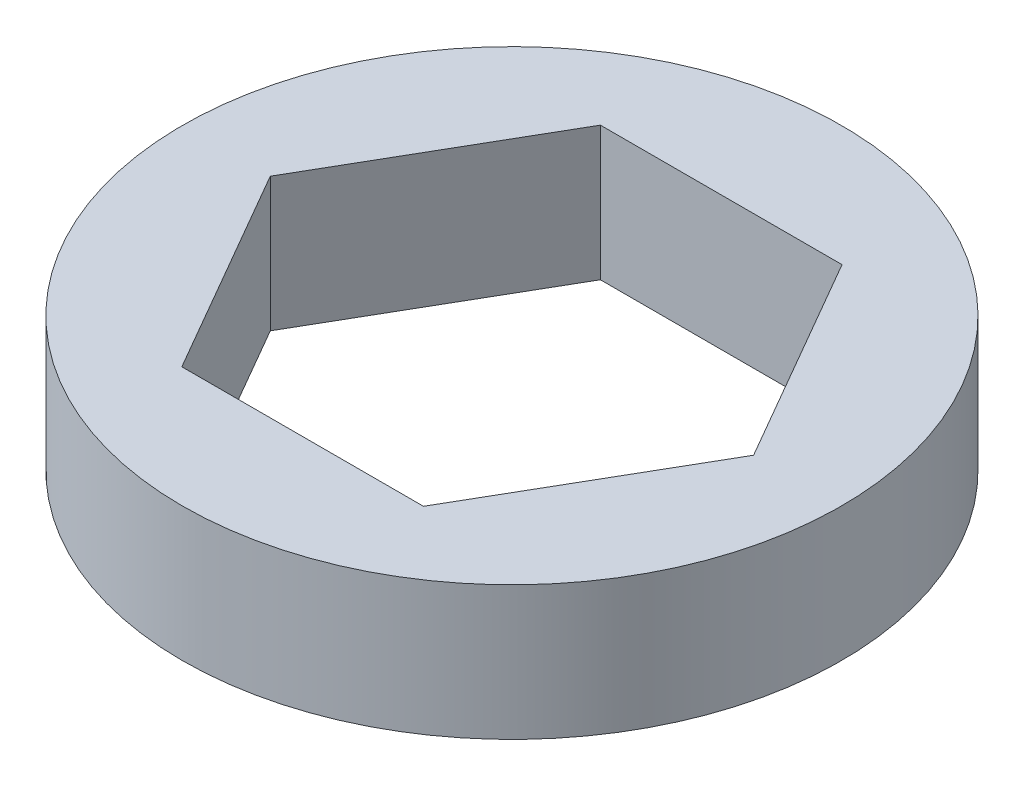
ISO-10303-21;
HEADER;
FILE_DESCRIPTION(('STEP AP214'),'2;1');
FILE_NAME('part.step','',(''),(''),'','','');
FILE_SCHEMA(('AUTOMOTIVE_DESIGN { 1 0 10303 214 1 1 1 1 }'));
ENDSEC;
DATA;
#1=APPLICATION_CONTEXT('core data for automotive mechanical design processes');
#2=APPLICATION_PROTOCOL_DEFINITION('international standard','automotive_design',2000,#1);
#3=PRODUCT_CONTEXT('',#1,'mechanical');
#4=PRODUCT('Part','Part','',(#3));
#5=PRODUCT_RELATED_PRODUCT_CATEGORY('part','',(#4));
#6=PRODUCT_DEFINITION_FORMATION('','',#4);
#7=PRODUCT_DEFINITION_CONTEXT('part definition',#1,'design');
#8=PRODUCT_DEFINITION('design','',#6,#7);
#9=PRODUCT_DEFINITION_SHAPE('','',#8);
#10=(LENGTH_UNIT() NAMED_UNIT(*) SI_UNIT(.MILLI.,.METRE.));
#11=(NAMED_UNIT(*) PLANE_ANGLE_UNIT() SI_UNIT($,.RADIAN.));
#12=(NAMED_UNIT(*) SI_UNIT($,.STERADIAN.) SOLID_ANGLE_UNIT());
#13=UNCERTAINTY_MEASURE_WITH_UNIT(LENGTH_MEASURE(1.E-05),#10,'distance_accuracy_value','');
#14=(GEOMETRIC_REPRESENTATION_CONTEXT(3) GLOBAL_UNCERTAINTY_ASSIGNED_CONTEXT((#13)) GLOBAL_UNIT_ASSIGNED_CONTEXT((#10,
#11,#12)) REPRESENTATION_CONTEXT('',''));
#15=CARTESIAN_POINT('',(0.,0.,0.));
#16=DIRECTION('',(0.,0.,1.));
#17=DIRECTION('',(1.,0.,0.));
#18=AXIS2_PLACEMENT_3D('',#15,#16,#17);
#19=CARTESIAN_POINT('',(0.,4.064,0.));
#20=DIRECTION('',(0.,1.,0.));
#21=DIRECTION('',(0.,0.,1.));
#22=AXIS2_PLACEMENT_3D('',#19,#20,#21);
#23=PLANE('',#22);
#24=CARTESIAN_POINT('',(0.,4.064,0.));
#25=DIRECTION('',(0.,1.,0.));
#26=DIRECTION('',(0.,0.,1.));
#27=AXIS2_PLACEMENT_3D('',#24,#25,#26);
#28=CIRCLE('',#27,10.);
#29=CARTESIAN_POINT('',(0.,4.064,10.));
#30=VERTEX_POINT('',#29);
#31=EDGE_CURVE('E11',#30,#30,#28,.T.);
#32=ORIENTED_EDGE('',*,*,#31,.T.);
#33=EDGE_LOOP('',(#32));
#34=FACE_BOUND('',#33,.T.);
#35=DIRECTION('',(0.5,0.,0.866025403784439));
#36=VECTOR('',#35,1.);
#37=CARTESIAN_POINT('',(-7.33234841870825,4.064,0.));
#38=LINE('',#37,#36);
#39=CARTESIAN_POINT('',(-7.33234841870825,4.064,0.));
#40=VERTEX_POINT('',#39);
#41=CARTESIAN_POINT('',(-3.66617420935413,4.064,6.35));
#42=VERTEX_POINT('',#41);
#43=EDGE_CURVE('E93',#40,#42,#38,.T.);
#44=ORIENTED_EDGE('',*,*,#43,.F.);
#45=DIRECTION('',(-0.5,0.,0.866025403784439));
#46=VECTOR('',#45,1.);
#47=CARTESIAN_POINT('',(-3.66617420935412,4.064,-6.35));
#48=LINE('',#47,#46);
#49=CARTESIAN_POINT('',(-3.66617420935412,4.064,-6.35));
#50=VERTEX_POINT('',#49);
#51=EDGE_CURVE('E85',#50,#40,#48,.T.);
#52=ORIENTED_EDGE('',*,*,#51,.F.);
#53=DIRECTION('',(-1.,0.,0.));
#54=VECTOR('',#53,1.);
#55=CARTESIAN_POINT('',(3.66617420935412,4.064,-6.35));
#56=LINE('',#55,#54);
#57=CARTESIAN_POINT('',(3.66617420935412,4.064,-6.35));
#58=VERTEX_POINT('',#57);
#59=EDGE_CURVE('E113',#58,#50,#56,.T.);
#60=ORIENTED_EDGE('',*,*,#59,.F.);
#61=DIRECTION('',(-0.5,0.,-0.866025403784439));
#62=VECTOR('',#61,1.);
#63=CARTESIAN_POINT('',(7.33234841870825,4.064,0.));
#64=LINE('',#63,#62);
#65=CARTESIAN_POINT('',(7.33234841870825,4.064,0.));
#66=VERTEX_POINT('',#65);
#67=EDGE_CURVE('E111',#66,#58,#64,.T.);
#68=ORIENTED_EDGE('',*,*,#67,.F.);
#69=DIRECTION('',(0.5,0.,-0.866025403784439));
#70=VECTOR('',#69,1.);
#71=CARTESIAN_POINT('',(3.66617420935412,4.064,6.35));
#72=LINE('',#71,#70);
#73=CARTESIAN_POINT('',(3.66617420935412,4.064,6.35));
#74=VERTEX_POINT('',#73);
#75=EDGE_CURVE('E107',#74,#66,#72,.T.);
#76=ORIENTED_EDGE('',*,*,#75,.F.);
#77=DIRECTION('',(1.,0.,0.));
#78=VECTOR('',#77,1.);
#79=CARTESIAN_POINT('',(-3.66617420935413,4.064,6.35));
#80=LINE('',#79,#78);
#81=EDGE_CURVE('E105',#42,#74,#80,.T.);
#82=ORIENTED_EDGE('',*,*,#81,.F.);
#83=EDGE_LOOP('',(#44,#52,#60,#68,#76,#82));
#84=FACE_BOUND('',#83,.T.);
#85=ADVANCED_FACE('F32',(#34,#84),#23,.T.);
#86=CARTESIAN_POINT('',(0.,0.,0.));
#87=DIRECTION('',(0.,1.,0.));
#88=DIRECTION('',(0.,0.,1.));
#89=AXIS2_PLACEMENT_3D('',#86,#87,#88);
#90=PLANE('',#89);
#91=CARTESIAN_POINT('',(0.,0.,0.));
#92=DIRECTION('',(0.,1.,0.));
#93=DIRECTION('',(0.,0.,1.));
#94=AXIS2_PLACEMENT_3D('',#91,#92,#93);
#95=CIRCLE('',#94,10.);
#96=CARTESIAN_POINT('',(0.,0.,10.));
#97=VERTEX_POINT('',#96);
#98=EDGE_CURVE('E36',#97,#97,#95,.T.);
#99=ORIENTED_EDGE('',*,*,#98,.F.);
#100=EDGE_LOOP('',(#99));
#101=FACE_BOUND('',#100,.T.);
#102=DIRECTION('',(-0.5,0.,0.866025403784439));
#103=VECTOR('',#102,1.);
#104=CARTESIAN_POINT('',(-3.66617420935412,0.,-6.35));
#105=LINE('',#104,#103);
#106=CARTESIAN_POINT('',(-3.66617420935412,0.,-6.35));
#107=VERTEX_POINT('',#106);
#108=CARTESIAN_POINT('',(-7.33234841870825,0.,0.));
#109=VERTEX_POINT('',#108);
#110=EDGE_CURVE('E55',#107,#109,#105,.T.);
#111=ORIENTED_EDGE('',*,*,#110,.T.);
#112=DIRECTION('',(0.5,0.,0.866025403784439));
#113=VECTOR('',#112,1.);
#114=CARTESIAN_POINT('',(-7.33234841870825,0.,0.));
#115=LINE('',#114,#113);
#116=CARTESIAN_POINT('',(-3.66617420935413,0.,6.35));
#117=VERTEX_POINT('',#116);
#118=EDGE_CURVE('E100',#109,#117,#115,.T.);
#119=ORIENTED_EDGE('',*,*,#118,.T.);
#120=DIRECTION('',(1.,0.,0.));
#121=VECTOR('',#120,1.);
#122=CARTESIAN_POINT('',(-3.66617420935413,0.,6.35));
#123=LINE('',#122,#121);
#124=CARTESIAN_POINT('',(3.66617420935412,0.,6.35));
#125=VERTEX_POINT('',#124);
#126=EDGE_CURVE('E117',#117,#125,#123,.T.);
#127=ORIENTED_EDGE('',*,*,#126,.T.);
#128=DIRECTION('',(0.5,0.,-0.866025403784439));
#129=VECTOR('',#128,1.);
#130=CARTESIAN_POINT('',(3.66617420935412,0.,6.35));
#131=LINE('',#130,#129);
#132=CARTESIAN_POINT('',(7.33234841870825,0.,0.));
#133=VERTEX_POINT('',#132);
#134=EDGE_CURVE('E120',#125,#133,#131,.T.);
#135=ORIENTED_EDGE('',*,*,#134,.T.);
#136=DIRECTION('',(-0.5,0.,-0.866025403784439));
#137=VECTOR('',#136,1.);
#138=CARTESIAN_POINT('',(7.33234841870825,0.,0.));
#139=LINE('',#138,#137);
#140=CARTESIAN_POINT('',(3.66617420935412,0.,-6.35));
#141=VERTEX_POINT('',#140);
#142=EDGE_CURVE('E123',#133,#141,#139,.T.);
#143=ORIENTED_EDGE('',*,*,#142,.T.);
#144=DIRECTION('',(-1.,0.,0.));
#145=VECTOR('',#144,1.);
#146=CARTESIAN_POINT('',(3.66617420935412,0.,-6.35));
#147=LINE('',#146,#145);
#148=EDGE_CURVE('E94',#141,#107,#147,.T.);
#149=ORIENTED_EDGE('',*,*,#148,.T.);
#150=EDGE_LOOP('',(#111,#119,#127,#135,#143,#149));
#151=FACE_BOUND('',#150,.T.);
#152=ADVANCED_FACE('F140',(#101,#151),#90,.F.);
#153=CARTESIAN_POINT('',(0.,4.064,0.));
#154=DIRECTION('',(0.,-1.,0.));
#155=DIRECTION('',(0.,0.,-1.));
#156=AXIS2_PLACEMENT_3D('',#153,#154,#155);
#157=CYLINDRICAL_SURFACE('',#156,10.);
#158=ORIENTED_EDGE('',*,*,#31,.F.);
#159=EDGE_LOOP('',(#158));
#160=FACE_BOUND('',#159,.T.);
#161=ORIENTED_EDGE('',*,*,#98,.T.);
#162=EDGE_LOOP('',(#161));
#163=FACE_BOUND('',#162,.T.);
#164=ADVANCED_FACE('F34',(#160,#163),#157,.T.);
#165=CARTESIAN_POINT('',(-3.66617420935412,4.064,-6.35));
#166=DIRECTION('',(0.866025403784439,0.,0.5));
#167=DIRECTION('',(0.5,0.,-0.866025403784439));
#168=AXIS2_PLACEMENT_3D('',#165,#166,#167);
#169=PLANE('',#168);
#170=ORIENTED_EDGE('',*,*,#110,.F.);
#171=DIRECTION('',(0.,-1.,0.));
#172=VECTOR('',#171,1.);
#173=CARTESIAN_POINT('',(-3.66617420935412,4.064,-6.35));
#174=LINE('',#173,#172);
#175=EDGE_CURVE('E89',#50,#107,#174,.T.);
#176=ORIENTED_EDGE('',*,*,#175,.F.);
#177=ORIENTED_EDGE('',*,*,#51,.T.);
#178=DIRECTION('',(0.,-1.,0.));
#179=VECTOR('',#178,1.);
#180=CARTESIAN_POINT('',(-7.33234841870825,4.064,0.));
#181=LINE('',#180,#179);
#182=EDGE_CURVE('E88',#40,#109,#181,.T.);
#183=ORIENTED_EDGE('',*,*,#182,.T.);
#184=EDGE_LOOP('',(#170,#176,#177,#183));
#185=FACE_BOUND('',#184,.T.);
#186=ADVANCED_FACE('F87',(#185),#169,.T.);
#187=CARTESIAN_POINT('',(-7.33234841870825,4.064,0.));
#188=DIRECTION('',(0.866025403784439,0.,-0.5));
#189=DIRECTION('',(-0.5,0.,-0.866025403784439));
#190=AXIS2_PLACEMENT_3D('',#187,#188,#189);
#191=PLANE('',#190);
#192=ORIENTED_EDGE('',*,*,#118,.F.);
#193=ORIENTED_EDGE('',*,*,#182,.F.);
#194=ORIENTED_EDGE('',*,*,#43,.T.);
#195=DIRECTION('',(0.,-1.,0.));
#196=VECTOR('',#195,1.);
#197=CARTESIAN_POINT('',(-3.66617420935413,4.064,6.35));
#198=LINE('',#197,#196);
#199=EDGE_CURVE('E101',#42,#117,#198,.T.);
#200=ORIENTED_EDGE('',*,*,#199,.T.);
#201=EDGE_LOOP('',(#192,#193,#194,#200));
#202=FACE_BOUND('',#201,.T.);
#203=ADVANCED_FACE('F97',(#202),#191,.T.);
#204=CARTESIAN_POINT('',(-3.66617420935413,4.064,6.35));
#205=DIRECTION('',(0.,0.,-1.));
#206=DIRECTION('',(-1.,0.,0.));
#207=AXIS2_PLACEMENT_3D('',#204,#205,#206);
#208=PLANE('',#207);
#209=ORIENTED_EDGE('',*,*,#126,.F.);
#210=ORIENTED_EDGE('',*,*,#199,.F.);
#211=ORIENTED_EDGE('',*,*,#81,.T.);
#212=DIRECTION('',(0.,-1.,0.));
#213=VECTOR('',#212,1.);
#214=CARTESIAN_POINT('',(3.66617420935412,4.064,6.35));
#215=LINE('',#214,#213);
#216=EDGE_CURVE('E132',#74,#125,#215,.T.);
#217=ORIENTED_EDGE('',*,*,#216,.T.);
#218=EDGE_LOOP('',(#209,#210,#211,#217));
#219=FACE_BOUND('',#218,.T.);
#220=ADVANCED_FACE('F136',(#219),#208,.T.);
#221=CARTESIAN_POINT('',(3.66617420935412,4.064,6.35));
#222=DIRECTION('',(-0.866025403784439,0.,-0.5));
#223=DIRECTION('',(-0.5,0.,0.866025403784439));
#224=AXIS2_PLACEMENT_3D('',#221,#222,#223);
#225=PLANE('',#224);
#226=ORIENTED_EDGE('',*,*,#134,.F.);
#227=ORIENTED_EDGE('',*,*,#216,.F.);
#228=ORIENTED_EDGE('',*,*,#75,.T.);
#229=DIRECTION('',(0.,-1.,0.));
#230=VECTOR('',#229,1.);
#231=CARTESIAN_POINT('',(7.33234841870825,4.064,0.));
#232=LINE('',#231,#230);
#233=EDGE_CURVE('E130',#66,#133,#232,.T.);
#234=ORIENTED_EDGE('',*,*,#233,.T.);
#235=EDGE_LOOP('',(#226,#227,#228,#234));
#236=FACE_BOUND('',#235,.T.);
#237=ADVANCED_FACE('F148',(#236),#225,.T.);
#238=CARTESIAN_POINT('',(7.33234841870825,4.064,0.));
#239=DIRECTION('',(-0.866025403784439,0.,0.5));
#240=DIRECTION('',(0.5,0.,0.866025403784439));
#241=AXIS2_PLACEMENT_3D('',#238,#239,#240);
#242=PLANE('',#241);
#243=ORIENTED_EDGE('',*,*,#142,.F.);
#244=ORIENTED_EDGE('',*,*,#233,.F.);
#245=ORIENTED_EDGE('',*,*,#67,.T.);
#246=DIRECTION('',(0.,-1.,0.));
#247=VECTOR('',#246,1.);
#248=CARTESIAN_POINT('',(3.66617420935412,4.064,-6.35));
#249=LINE('',#248,#247);
#250=EDGE_CURVE('E47',#58,#141,#249,.T.);
#251=ORIENTED_EDGE('',*,*,#250,.T.);
#252=EDGE_LOOP('',(#243,#244,#245,#251));
#253=FACE_BOUND('',#252,.T.);
#254=ADVANCED_FACE('F146',(#253),#242,.T.);
#255=CARTESIAN_POINT('',(3.66617420935412,4.064,-6.35));
#256=DIRECTION('',(0.,0.,1.));
#257=DIRECTION('',(1.,0.,0.));
#258=AXIS2_PLACEMENT_3D('',#255,#256,#257);
#259=PLANE('',#258);
#260=ORIENTED_EDGE('',*,*,#148,.F.);
#261=ORIENTED_EDGE('',*,*,#250,.F.);
#262=ORIENTED_EDGE('',*,*,#59,.T.);
#263=ORIENTED_EDGE('',*,*,#175,.T.);
#264=EDGE_LOOP('',(#260,#261,#262,#263));
#265=FACE_BOUND('',#264,.T.);
#266=ADVANCED_FACE('F142',(#265),#259,.T.);
#267=CLOSED_SHELL('',(#85,#152,#164,#186,#203,#220,#237,#254,#266));
#268=MANIFOLD_SOLID_BREP('B2',#267);
#269=ADVANCED_BREP_SHAPE_REPRESENTATION('',(#18,#268),#14);
#270=SHAPE_DEFINITION_REPRESENTATION(#9,#269);
ENDSEC;
END-ISO-10303-21;
